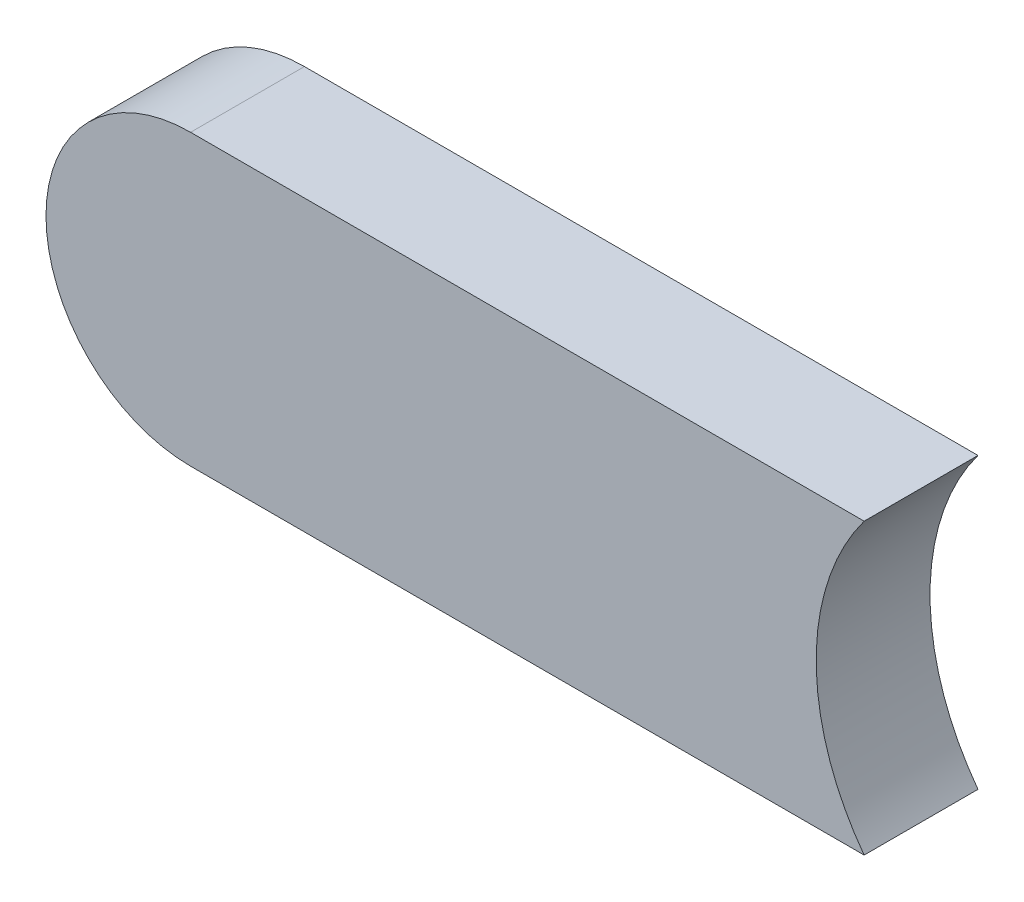
ISO-10303-21;
HEADER;
FILE_DESCRIPTION(('STEP AP214'),'2;1');
FILE_NAME('part.step','',(''),(''),'','','');
FILE_SCHEMA(('AUTOMOTIVE_DESIGN { 1 0 10303 214 1 1 1 1 }'));
ENDSEC;
DATA;
#1=APPLICATION_CONTEXT('core data for automotive mechanical design processes');
#2=APPLICATION_PROTOCOL_DEFINITION('international standard','automotive_design',2000,#1);
#3=PRODUCT_CONTEXT('',#1,'mechanical');
#4=PRODUCT('Part','Part','',(#3));
#5=PRODUCT_RELATED_PRODUCT_CATEGORY('part','',(#4));
#6=PRODUCT_DEFINITION_FORMATION('','',#4);
#7=PRODUCT_DEFINITION_CONTEXT('part definition',#1,'design');
#8=PRODUCT_DEFINITION('design','',#6,#7);
#9=PRODUCT_DEFINITION_SHAPE('','',#8);
#10=(LENGTH_UNIT() NAMED_UNIT(*) SI_UNIT(.MILLI.,.METRE.));
#11=(NAMED_UNIT(*) PLANE_ANGLE_UNIT() SI_UNIT($,.RADIAN.));
#12=(NAMED_UNIT(*) SI_UNIT($,.STERADIAN.) SOLID_ANGLE_UNIT());
#13=UNCERTAINTY_MEASURE_WITH_UNIT(LENGTH_MEASURE(1.E-05),#10,'distance_accuracy_value','');
#14=(GEOMETRIC_REPRESENTATION_CONTEXT(3) GLOBAL_UNCERTAINTY_ASSIGNED_CONTEXT((#13)) GLOBAL_UNIT_ASSIGNED_CONTEXT((#10,
#11,#12)) REPRESENTATION_CONTEXT('',''));
#15=CARTESIAN_POINT('',(0.,0.,0.));
#16=DIRECTION('',(0.,0.,1.));
#17=DIRECTION('',(1.,0.,0.));
#18=AXIS2_PLACEMENT_3D('',#15,#16,#17);
#19=CARTESIAN_POINT('',(138.684,114.808,0.));
#20=DIRECTION('',(0.,1.,0.));
#21=DIRECTION('',(1.,0.,0.));
#22=AXIS2_PLACEMENT_3D('',#19,#20,#21);
#23=PLANE('',#22);
#24=DIRECTION('',(1.,0.,0.));
#25=VECTOR('',#24,1.);
#26=CARTESIAN_POINT('',(138.684,114.808,0.1999996));
#27=LINE('',#26,#25);
#28=CARTESIAN_POINT('',(138.684,114.808,0.1999996));
#29=VERTEX_POINT('',#28);
#30=CARTESIAN_POINT('',(139.867251768896,114.808,0.1999996));
#31=VERTEX_POINT('',#30);
#32=EDGE_CURVE('E11',#29,#31,#27,.T.);
#33=ORIENTED_EDGE('',*,*,#32,.F.);
#34=DIRECTION('',(0.,0.,1.));
#35=VECTOR('',#34,1.);
#36=CARTESIAN_POINT('',(138.684,114.808,0.));
#37=LINE('',#36,#35);
#38=CARTESIAN_POINT('',(138.684,114.808,0.));
#39=VERTEX_POINT('',#38);
#40=EDGE_CURVE('E24',#39,#29,#37,.T.);
#41=ORIENTED_EDGE('',*,*,#40,.F.);
#42=DIRECTION('',(1.,0.,0.));
#43=VECTOR('',#42,1.);
#44=CARTESIAN_POINT('',(138.684,114.808,0.));
#45=LINE('',#44,#43);
#46=CARTESIAN_POINT('',(139.867251768896,114.808,0.));
#47=VERTEX_POINT('',#46);
#48=EDGE_CURVE('E75',#39,#47,#45,.T.);
#49=ORIENTED_EDGE('',*,*,#48,.T.);
#50=DIRECTION('',(0.,0.,1.));
#51=VECTOR('',#50,1.);
#52=CARTESIAN_POINT('',(139.867251768896,114.808,0.));
#53=LINE('',#52,#51);
#54=EDGE_CURVE('E37',#47,#31,#53,.T.);
#55=ORIENTED_EDGE('',*,*,#54,.T.);
#56=EDGE_LOOP('',(#33,#41,#49,#55));
#57=FACE_BOUND('',#56,.T.);
#58=ADVANCED_FACE('F17',(#57),#23,.F.);
#59=CARTESIAN_POINT('',(140.208,115.062,0.));
#60=DIRECTION('',(0.,0.,-1.));
#61=DIRECTION('',(1.,0.,0.));
#62=AXIS2_PLACEMENT_3D('',#59,#60,#61);
#63=CYLINDRICAL_SURFACE('',#62,0.42500042);
#64=DIRECTION('',(0.,0.,1.));
#65=VECTOR('',#64,1.);
#66=CARTESIAN_POINT('',(139.867251768896,115.316,0.));
#67=LINE('',#66,#65);
#68=CARTESIAN_POINT('',(139.867251768896,115.316,0.));
#69=VERTEX_POINT('',#68);
#70=CARTESIAN_POINT('',(139.867251768896,115.316,0.1999996));
#71=VERTEX_POINT('',#70);
#72=EDGE_CURVE('E67',#69,#71,#67,.T.);
#73=ORIENTED_EDGE('',*,*,#72,.T.);
#74=CARTESIAN_POINT('',(140.208,115.062,0.1999996));
#75=DIRECTION('',(0.,0.,1.));
#76=DIRECTION('',(1.,0.,0.));
#77=AXIS2_PLACEMENT_3D('',#74,#75,#76);
#78=CIRCLE('',#77,0.42500042);
#79=EDGE_CURVE('E82',#71,#31,#78,.T.);
#80=ORIENTED_EDGE('',*,*,#79,.T.);
#81=ORIENTED_EDGE('',*,*,#54,.F.);
#82=CARTESIAN_POINT('',(140.208,115.062,0.));
#83=DIRECTION('',(0.,0.,1.));
#84=DIRECTION('',(1.,0.,0.));
#85=AXIS2_PLACEMENT_3D('',#82,#83,#84);
#86=CIRCLE('',#85,0.42500042);
#87=EDGE_CURVE('E80',#69,#47,#86,.T.);
#88=ORIENTED_EDGE('',*,*,#87,.F.);
#89=EDGE_LOOP('',(#73,#80,#81,#88));
#90=FACE_BOUND('',#89,.T.);
#91=ADVANCED_FACE('F88',(#90),#63,.F.);
#92=CARTESIAN_POINT('',(139.867251768896,115.316,0.));
#93=DIRECTION('',(0.,-1.,0.));
#94=DIRECTION('',(-1.,0.,0.));
#95=AXIS2_PLACEMENT_3D('',#92,#93,#94);
#96=PLANE('',#95);
#97=DIRECTION('',(-1.,0.,0.));
#98=VECTOR('',#97,1.);
#99=CARTESIAN_POINT('',(140.208,115.316,0.1999996));
#100=LINE('',#99,#98);
#101=CARTESIAN_POINT('',(138.684,115.316,0.1999996));
#102=VERTEX_POINT('',#101);
#103=EDGE_CURVE('E71',#71,#102,#100,.T.);
#104=ORIENTED_EDGE('',*,*,#103,.F.);
#105=ORIENTED_EDGE('',*,*,#72,.F.);
#106=DIRECTION('',(-1.,0.,0.));
#107=VECTOR('',#106,1.);
#108=CARTESIAN_POINT('',(140.208,115.316,0.));
#109=LINE('',#108,#107);
#110=CARTESIAN_POINT('',(138.684,115.316,0.));
#111=VERTEX_POINT('',#110);
#112=EDGE_CURVE('E63',#69,#111,#109,.T.);
#113=ORIENTED_EDGE('',*,*,#112,.T.);
#114=DIRECTION('',(0.,0.,1.));
#115=VECTOR('',#114,1.);
#116=CARTESIAN_POINT('',(138.684,115.316,0.));
#117=LINE('',#116,#115);
#118=EDGE_CURVE('E53',#111,#102,#117,.T.);
#119=ORIENTED_EDGE('',*,*,#118,.T.);
#120=EDGE_LOOP('',(#104,#105,#113,#119));
#121=FACE_BOUND('',#120,.T.);
#122=ADVANCED_FACE('F66',(#121),#96,.F.);
#123=CARTESIAN_POINT('',(138.684,115.062,0.));
#124=DIRECTION('',(0.,0.,-1.));
#125=DIRECTION('',(-1.11896493820486E-13,1.,0.));
#126=AXIS2_PLACEMENT_3D('',#123,#124,#125);
#127=CYLINDRICAL_SURFACE('',#126,0.254000000000005);
#128=CARTESIAN_POINT('',(138.684,115.062,0.1999996));
#129=DIRECTION('',(0.,0.,1.));
#130=DIRECTION('',(-1.11896493820486E-13,1.,0.));
#131=AXIS2_PLACEMENT_3D('',#128,#129,#130);
#132=CIRCLE('',#131,0.254000000000005);
#133=EDGE_CURVE('E59',#102,#29,#132,.T.);
#134=ORIENTED_EDGE('',*,*,#133,.F.);
#135=ORIENTED_EDGE('',*,*,#118,.F.);
#136=CARTESIAN_POINT('',(138.684,115.062,0.));
#137=DIRECTION('',(0.,0.,1.));
#138=DIRECTION('',(-1.11896493820486E-13,1.,0.));
#139=AXIS2_PLACEMENT_3D('',#136,#137,#138);
#140=CIRCLE('',#139,0.254000000000005);
#141=EDGE_CURVE('E57',#111,#39,#140,.T.);
#142=ORIENTED_EDGE('',*,*,#141,.T.);
#143=ORIENTED_EDGE('',*,*,#40,.T.);
#144=EDGE_LOOP('',(#134,#135,#142,#143));
#145=FACE_BOUND('',#144,.T.);
#146=ADVANCED_FACE('F55',(#145),#127,.T.);
#147=CARTESIAN_POINT('',(138.684,114.808,0.));
#148=DIRECTION('',(0.,0.,-1.));
#149=DIRECTION('',(-1.,0.,0.));
#150=AXIS2_PLACEMENT_3D('',#147,#148,#149);
#151=PLANE('',#150);
#152=ORIENTED_EDGE('',*,*,#48,.F.);
#153=ORIENTED_EDGE('',*,*,#141,.F.);
#154=ORIENTED_EDGE('',*,*,#112,.F.);
#155=ORIENTED_EDGE('',*,*,#87,.T.);
#156=EDGE_LOOP('',(#152,#153,#154,#155));
#157=FACE_BOUND('',#156,.T.);
#158=ADVANCED_FACE('F74',(#157),#151,.T.);
#159=CARTESIAN_POINT('',(138.684,114.808,0.1999996));
#160=DIRECTION('',(0.,0.,-1.));
#161=DIRECTION('',(-1.,0.,0.));
#162=AXIS2_PLACEMENT_3D('',#159,#160,#161);
#163=PLANE('',#162);
#164=ORIENTED_EDGE('',*,*,#133,.T.);
#165=ORIENTED_EDGE('',*,*,#32,.T.);
#166=ORIENTED_EDGE('',*,*,#79,.F.);
#167=ORIENTED_EDGE('',*,*,#103,.T.);
#168=EDGE_LOOP('',(#164,#165,#166,#167));
#169=FACE_BOUND('',#168,.T.);
#170=ADVANCED_FACE('F91',(#169),#163,.F.);
#171=CLOSED_SHELL('',(#58,#91,#122,#146,#158,#170));
#172=MANIFOLD_SOLID_BREP('B1',#171);
#173=ADVANCED_BREP_SHAPE_REPRESENTATION('',(#18,#172),#14);
#174=SHAPE_DEFINITION_REPRESENTATION(#9,#173);
ENDSEC;
END-ISO-10303-21;
